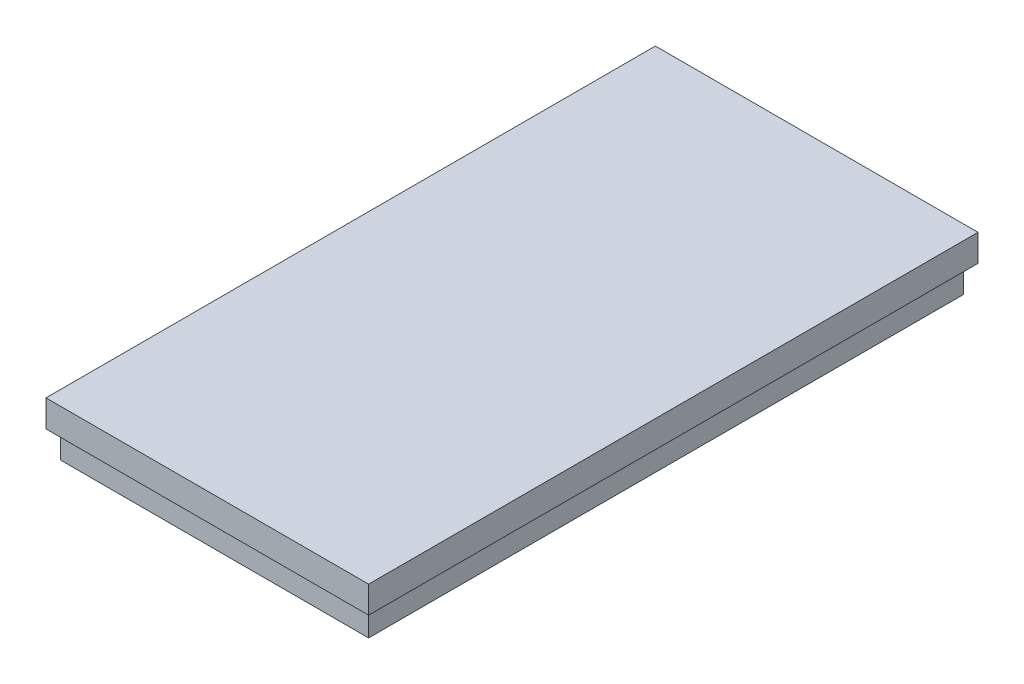
ISO-10303-21;
HEADER;
FILE_DESCRIPTION(('STEP AP214'),'2;1');
FILE_NAME('part.step','',(''),(''),'','','');
FILE_SCHEMA(('AUTOMOTIVE_DESIGN { 1 0 10303 214 1 1 1 1 }'));
ENDSEC;
DATA;
#1=APPLICATION_CONTEXT('core data for automotive mechanical design processes');
#2=APPLICATION_PROTOCOL_DEFINITION('international standard','automotive_design',2000,#1);
#3=PRODUCT_CONTEXT('',#1,'mechanical');
#4=PRODUCT('Part','Part','',(#3));
#5=PRODUCT_RELATED_PRODUCT_CATEGORY('part','',(#4));
#6=PRODUCT_DEFINITION_FORMATION('','',#4);
#7=PRODUCT_DEFINITION_CONTEXT('part definition',#1,'design');
#8=PRODUCT_DEFINITION('design','',#6,#7);
#9=PRODUCT_DEFINITION_SHAPE('','',#8);
#10=(LENGTH_UNIT() NAMED_UNIT(*) SI_UNIT(.MILLI.,.METRE.));
#11=(NAMED_UNIT(*) PLANE_ANGLE_UNIT() SI_UNIT($,.RADIAN.));
#12=(NAMED_UNIT(*) SI_UNIT($,.STERADIAN.) SOLID_ANGLE_UNIT());
#13=UNCERTAINTY_MEASURE_WITH_UNIT(LENGTH_MEASURE(1.E-05),#10,'distance_accuracy_value','');
#14=(GEOMETRIC_REPRESENTATION_CONTEXT(3) GLOBAL_UNCERTAINTY_ASSIGNED_CONTEXT((#13)) GLOBAL_UNIT_ASSIGNED_CONTEXT((#10,
#11,#12)) REPRESENTATION_CONTEXT('',''));
#15=CARTESIAN_POINT('',(0.,0.,0.));
#16=DIRECTION('',(0.,0.,1.));
#17=DIRECTION('',(1.,0.,0.));
#18=AXIS2_PLACEMENT_3D('',#15,#16,#17);
#19=CARTESIAN_POINT('',(0.,0.,0.));
#20=DIRECTION('',(0.,1.,0.));
#21=DIRECTION('',(0.,0.,1.));
#22=AXIS2_PLACEMENT_3D('',#19,#20,#21);
#23=PLANE('',#22);
#24=DIRECTION('',(0.,0.,1.));
#25=VECTOR('',#24,1.);
#26=CARTESIAN_POINT('',(-45.,0.,-85.));
#27=LINE('',#26,#25);
#28=CARTESIAN_POINT('',(-45.,0.,-85.));
#29=VERTEX_POINT('',#28);
#30=CARTESIAN_POINT('',(-45.,0.,85.));
#31=VERTEX_POINT('',#30);
#32=EDGE_CURVE('E190',#29,#31,#27,.T.);
#33=ORIENTED_EDGE('',*,*,#32,.F.);
#34=DIRECTION('',(-1.,0.,0.));
#35=VECTOR('',#34,1.);
#36=CARTESIAN_POINT('',(-45.,0.,-85.));
#37=LINE('',#36,#35);
#38=CARTESIAN_POINT('',(45.,0.,-85.));
#39=VERTEX_POINT('',#38);
#40=EDGE_CURVE('E195',#39,#29,#37,.T.);
#41=ORIENTED_EDGE('',*,*,#40,.F.);
#42=DIRECTION('',(0.,0.,-1.));
#43=VECTOR('',#42,1.);
#44=CARTESIAN_POINT('',(45.,0.,-85.));
#45=LINE('',#44,#43);
#46=CARTESIAN_POINT('',(45.,0.,85.));
#47=VERTEX_POINT('',#46);
#48=EDGE_CURVE('E206',#47,#39,#45,.T.);
#49=ORIENTED_EDGE('',*,*,#48,.F.);
#50=DIRECTION('',(1.,0.,0.));
#51=VECTOR('',#50,1.);
#52=CARTESIAN_POINT('',(-45.,0.,85.));
#53=LINE('',#52,#51);
#54=EDGE_CURVE('E204',#31,#47,#53,.T.);
#55=ORIENTED_EDGE('',*,*,#54,.F.);
#56=EDGE_LOOP('',(#33,#41,#49,#55));
#57=FACE_BOUND('',#56,.T.);
#58=DIRECTION('',(0.,0.,-1.));
#59=VECTOR('',#58,1.);
#60=CARTESIAN_POINT('',(-43.,0.,83.));
#61=LINE('',#60,#59);
#62=CARTESIAN_POINT('',(-43.,0.,83.));
#63=VERTEX_POINT('',#62);
#64=CARTESIAN_POINT('',(-43.,0.,-83.));
#65=VERTEX_POINT('',#64);
#66=EDGE_CURVE('E56',#63,#65,#61,.T.);
#67=ORIENTED_EDGE('',*,*,#66,.F.);
#68=DIRECTION('',(-1.,0.,0.));
#69=VECTOR('',#68,1.);
#70=CARTESIAN_POINT('',(-43.,0.,83.));
#71=LINE('',#70,#69);
#72=CARTESIAN_POINT('',(43.,0.,83.));
#73=VERTEX_POINT('',#72);
#74=EDGE_CURVE('E164',#73,#63,#71,.T.);
#75=ORIENTED_EDGE('',*,*,#74,.F.);
#76=DIRECTION('',(0.,0.,1.));
#77=VECTOR('',#76,1.);
#78=CARTESIAN_POINT('',(43.,0.,83.));
#79=LINE('',#78,#77);
#80=CARTESIAN_POINT('',(43.,0.,-83.));
#81=VERTEX_POINT('',#80);
#82=EDGE_CURVE('E175',#81,#73,#79,.T.);
#83=ORIENTED_EDGE('',*,*,#82,.F.);
#84=DIRECTION('',(1.,0.,0.));
#85=VECTOR('',#84,1.);
#86=CARTESIAN_POINT('',(-43.,0.,-83.));
#87=LINE('',#86,#85);
#88=EDGE_CURVE('E172',#65,#81,#87,.T.);
#89=ORIENTED_EDGE('',*,*,#88,.F.);
#90=EDGE_LOOP('',(#67,#75,#83,#89));
#91=FACE_BOUND('',#90,.T.);
#92=ADVANCED_FACE('F33',(#57,#91),#23,.F.);
#93=CARTESIAN_POINT('',(-45.,7.5,-85.));
#94=DIRECTION('',(1.,0.,0.));
#95=DIRECTION('',(0.,0.,-1.));
#96=AXIS2_PLACEMENT_3D('',#93,#94,#95);
#97=PLANE('',#96);
#98=ORIENTED_EDGE('',*,*,#32,.T.);
#99=DIRECTION('',(0.,-1.,0.));
#100=VECTOR('',#99,1.);
#101=CARTESIAN_POINT('',(-45.,7.5,85.));
#102=LINE('',#101,#100);
#103=CARTESIAN_POINT('',(-45.,7.5,85.));
#104=VERTEX_POINT('',#103);
#105=EDGE_CURVE('E11',#104,#31,#102,.T.);
#106=ORIENTED_EDGE('',*,*,#105,.F.);
#107=DIRECTION('',(0.,0.,1.));
#108=VECTOR('',#107,1.);
#109=CARTESIAN_POINT('',(-45.,7.5,-85.));
#110=LINE('',#109,#108);
#111=CARTESIAN_POINT('',(-45.,7.5,-85.));
#112=VERTEX_POINT('',#111);
#113=EDGE_CURVE('E191',#112,#104,#110,.T.);
#114=ORIENTED_EDGE('',*,*,#113,.F.);
#115=DIRECTION('',(0.,-1.,0.));
#116=VECTOR('',#115,1.);
#117=CARTESIAN_POINT('',(-45.,7.5,-85.));
#118=LINE('',#117,#116);
#119=EDGE_CURVE('E201',#112,#29,#118,.T.);
#120=ORIENTED_EDGE('',*,*,#119,.T.);
#121=EDGE_LOOP('',(#98,#106,#114,#120));
#122=FACE_BOUND('',#121,.T.);
#123=ADVANCED_FACE('F35',(#122),#97,.F.);
#124=CARTESIAN_POINT('',(-45.,7.5,85.));
#125=DIRECTION('',(0.,0.,-1.));
#126=DIRECTION('',(-1.,0.,0.));
#127=AXIS2_PLACEMENT_3D('',#124,#125,#126);
#128=PLANE('',#127);
#129=ORIENTED_EDGE('',*,*,#54,.T.);
#130=DIRECTION('',(0.,-1.,0.));
#131=VECTOR('',#130,1.);
#132=CARTESIAN_POINT('',(45.,7.5,85.));
#133=LINE('',#132,#131);
#134=CARTESIAN_POINT('',(45.,7.5,85.));
#135=VERTEX_POINT('',#134);
#136=EDGE_CURVE('E41',#135,#47,#133,.T.);
#137=ORIENTED_EDGE('',*,*,#136,.F.);
#138=DIRECTION('',(1.,0.,0.));
#139=VECTOR('',#138,1.);
#140=CARTESIAN_POINT('',(-45.,7.5,85.));
#141=LINE('',#140,#139);
#142=EDGE_CURVE('E194',#104,#135,#141,.T.);
#143=ORIENTED_EDGE('',*,*,#142,.F.);
#144=ORIENTED_EDGE('',*,*,#105,.T.);
#145=EDGE_LOOP('',(#129,#137,#143,#144));
#146=FACE_BOUND('',#145,.T.);
#147=ADVANCED_FACE('F233',(#146),#128,.F.);
#148=CARTESIAN_POINT('',(45.,7.5,-85.));
#149=DIRECTION('',(-1.,0.,0.));
#150=DIRECTION('',(0.,0.,1.));
#151=AXIS2_PLACEMENT_3D('',#148,#149,#150);
#152=PLANE('',#151);
#153=ORIENTED_EDGE('',*,*,#48,.T.);
#154=DIRECTION('',(0.,-1.,0.));
#155=VECTOR('',#154,1.);
#156=CARTESIAN_POINT('',(45.,7.5,-85.));
#157=LINE('',#156,#155);
#158=CARTESIAN_POINT('',(45.,7.5,-85.));
#159=VERTEX_POINT('',#158);
#160=EDGE_CURVE('E211',#159,#39,#157,.T.);
#161=ORIENTED_EDGE('',*,*,#160,.F.);
#162=DIRECTION('',(0.,0.,-1.));
#163=VECTOR('',#162,1.);
#164=CARTESIAN_POINT('',(45.,7.5,-85.));
#165=LINE('',#164,#163);
#166=EDGE_CURVE('E197',#135,#159,#165,.T.);
#167=ORIENTED_EDGE('',*,*,#166,.F.);
#168=ORIENTED_EDGE('',*,*,#136,.T.);
#169=EDGE_LOOP('',(#153,#161,#167,#168));
#170=FACE_BOUND('',#169,.T.);
#171=ADVANCED_FACE('F218',(#170),#152,.F.);
#172=CARTESIAN_POINT('',(-45.,7.5,-85.));
#173=DIRECTION('',(0.,0.,1.));
#174=DIRECTION('',(1.,0.,0.));
#175=AXIS2_PLACEMENT_3D('',#172,#173,#174);
#176=PLANE('',#175);
#177=ORIENTED_EDGE('',*,*,#40,.T.);
#178=ORIENTED_EDGE('',*,*,#119,.F.);
#179=DIRECTION('',(-1.,0.,0.));
#180=VECTOR('',#179,1.);
#181=CARTESIAN_POINT('',(-45.,7.5,-85.));
#182=LINE('',#181,#180);
#183=EDGE_CURVE('E199',#159,#112,#182,.T.);
#184=ORIENTED_EDGE('',*,*,#183,.F.);
#185=ORIENTED_EDGE('',*,*,#160,.T.);
#186=EDGE_LOOP('',(#177,#178,#184,#185));
#187=FACE_BOUND('',#186,.T.);
#188=ADVANCED_FACE('F226',(#187),#176,.F.);
#189=CARTESIAN_POINT('',(0.,7.5,0.));
#190=DIRECTION('',(0.,1.,0.));
#191=DIRECTION('',(0.,0.,1.));
#192=AXIS2_PLACEMENT_3D('',#189,#190,#191);
#193=PLANE('',#192);
#194=ORIENTED_EDGE('',*,*,#113,.T.);
#195=ORIENTED_EDGE('',*,*,#142,.T.);
#196=ORIENTED_EDGE('',*,*,#166,.T.);
#197=ORIENTED_EDGE('',*,*,#183,.T.);
#198=EDGE_LOOP('',(#194,#195,#196,#197));
#199=FACE_BOUND('',#198,.T.);
#200=ADVANCED_FACE('F232',(#199),#193,.T.);
#201=CARTESIAN_POINT('',(-43.,-7.5,83.));
#202=DIRECTION('',(1.,0.,0.));
#203=DIRECTION('',(0.,0.,-1.));
#204=AXIS2_PLACEMENT_3D('',#201,#202,#203);
#205=PLANE('',#204);
#206=ORIENTED_EDGE('',*,*,#66,.T.);
#207=DIRECTION('',(0.,1.,0.));
#208=VECTOR('',#207,1.);
#209=CARTESIAN_POINT('',(-43.,-7.5,-83.));
#210=LINE('',#209,#208);
#211=CARTESIAN_POINT('',(-43.,-7.5,-83.));
#212=VERTEX_POINT('',#211);
#213=EDGE_CURVE('E187',#212,#65,#210,.T.);
#214=ORIENTED_EDGE('',*,*,#213,.F.);
#215=DIRECTION('',(0.,0.,-1.));
#216=VECTOR('',#215,1.);
#217=CARTESIAN_POINT('',(-43.,-7.5,83.));
#218=LINE('',#217,#216);
#219=CARTESIAN_POINT('',(-43.,-7.5,83.));
#220=VERTEX_POINT('',#219);
#221=EDGE_CURVE('E160',#220,#212,#218,.T.);
#222=ORIENTED_EDGE('',*,*,#221,.F.);
#223=DIRECTION('',(0.,1.,0.));
#224=VECTOR('',#223,1.);
#225=CARTESIAN_POINT('',(-43.,-7.5,83.));
#226=LINE('',#225,#224);
#227=EDGE_CURVE('E170',#220,#63,#226,.T.);
#228=ORIENTED_EDGE('',*,*,#227,.T.);
#229=EDGE_LOOP('',(#206,#214,#222,#228));
#230=FACE_BOUND('',#229,.T.);
#231=ADVANCED_FACE('F251',(#230),#205,.F.);
#232=CARTESIAN_POINT('',(-43.,-7.5,-83.));
#233=DIRECTION('',(0.,0.,1.));
#234=DIRECTION('',(1.,0.,0.));
#235=AXIS2_PLACEMENT_3D('',#232,#233,#234);
#236=PLANE('',#235);
#237=ORIENTED_EDGE('',*,*,#88,.T.);
#238=DIRECTION('',(0.,1.,0.));
#239=VECTOR('',#238,1.);
#240=CARTESIAN_POINT('',(43.,-7.5,-83.));
#241=LINE('',#240,#239);
#242=CARTESIAN_POINT('',(43.,-7.5,-83.));
#243=VERTEX_POINT('',#242);
#244=EDGE_CURVE('E184',#243,#81,#241,.T.);
#245=ORIENTED_EDGE('',*,*,#244,.F.);
#246=DIRECTION('',(1.,0.,0.));
#247=VECTOR('',#246,1.);
#248=CARTESIAN_POINT('',(-43.,-7.5,-83.));
#249=LINE('',#248,#247);
#250=EDGE_CURVE('E163',#212,#243,#249,.T.);
#251=ORIENTED_EDGE('',*,*,#250,.F.);
#252=ORIENTED_EDGE('',*,*,#213,.T.);
#253=EDGE_LOOP('',(#237,#245,#251,#252));
#254=FACE_BOUND('',#253,.T.);
#255=ADVANCED_FACE('F255',(#254),#236,.F.);
#256=CARTESIAN_POINT('',(43.,-7.5,83.));
#257=DIRECTION('',(-1.,0.,0.));
#258=DIRECTION('',(0.,0.,1.));
#259=AXIS2_PLACEMENT_3D('',#256,#257,#258);
#260=PLANE('',#259);
#261=ORIENTED_EDGE('',*,*,#82,.T.);
#262=DIRECTION('',(0.,1.,0.));
#263=VECTOR('',#262,1.);
#264=CARTESIAN_POINT('',(43.,-7.5,83.));
#265=LINE('',#264,#263);
#266=CARTESIAN_POINT('',(43.,-7.5,83.));
#267=VERTEX_POINT('',#266);
#268=EDGE_CURVE('E181',#267,#73,#265,.T.);
#269=ORIENTED_EDGE('',*,*,#268,.F.);
#270=DIRECTION('',(0.,0.,1.));
#271=VECTOR('',#270,1.);
#272=CARTESIAN_POINT('',(43.,-7.5,83.));
#273=LINE('',#272,#271);
#274=EDGE_CURVE('E166',#243,#267,#273,.T.);
#275=ORIENTED_EDGE('',*,*,#274,.F.);
#276=ORIENTED_EDGE('',*,*,#244,.T.);
#277=EDGE_LOOP('',(#261,#269,#275,#276));
#278=FACE_BOUND('',#277,.T.);
#279=ADVANCED_FACE('F260',(#278),#260,.F.);
#280=CARTESIAN_POINT('',(-43.,-7.5,83.));
#281=DIRECTION('',(0.,0.,-1.));
#282=DIRECTION('',(-1.,0.,0.));
#283=AXIS2_PLACEMENT_3D('',#280,#281,#282);
#284=PLANE('',#283);
#285=ORIENTED_EDGE('',*,*,#74,.T.);
#286=ORIENTED_EDGE('',*,*,#227,.F.);
#287=DIRECTION('',(-1.,0.,0.));
#288=VECTOR('',#287,1.);
#289=CARTESIAN_POINT('',(-43.,-7.5,83.));
#290=LINE('',#289,#288);
#291=EDGE_CURVE('E168',#267,#220,#290,.T.);
#292=ORIENTED_EDGE('',*,*,#291,.F.);
#293=ORIENTED_EDGE('',*,*,#268,.T.);
#294=EDGE_LOOP('',(#285,#286,#292,#293));
#295=FACE_BOUND('',#294,.T.);
#296=ADVANCED_FACE('F266',(#295),#284,.F.);
#297=CARTESIAN_POINT('',(0.,-7.5,0.));
#298=DIRECTION('',(0.,-1.,0.));
#299=DIRECTION('',(0.,0.,-1.));
#300=AXIS2_PLACEMENT_3D('',#297,#298,#299);
#301=PLANE('',#300);
#302=DIRECTION('',(0.,0.,-1.));
#303=VECTOR('',#302,1.);
#304=CARTESIAN_POINT('',(-36.,-7.5,76.));
#305=LINE('',#304,#303);
#306=CARTESIAN_POINT('',(-36.,-7.5,76.));
#307=VERTEX_POINT('',#306);
#308=CARTESIAN_POINT('',(-36.,-7.5,-76.));
#309=VERTEX_POINT('',#308);
#310=EDGE_CURVE('E48',#307,#309,#305,.T.);
#311=ORIENTED_EDGE('',*,*,#310,.F.);
#312=DIRECTION('',(-1.,0.,0.));
#313=VECTOR('',#312,1.);
#314=CARTESIAN_POINT('',(-36.,-7.5,76.));
#315=LINE('',#314,#313);
#316=CARTESIAN_POINT('',(36.,-7.5,76.));
#317=VERTEX_POINT('',#316);
#318=EDGE_CURVE('E142',#317,#307,#315,.T.);
#319=ORIENTED_EDGE('',*,*,#318,.F.);
#320=DIRECTION('',(0.,0.,1.));
#321=VECTOR('',#320,1.);
#322=CARTESIAN_POINT('',(36.,-7.5,76.));
#323=LINE('',#322,#321);
#324=CARTESIAN_POINT('',(36.,-7.5,-76.));
#325=VERTEX_POINT('',#324);
#326=EDGE_CURVE('E145',#325,#317,#323,.T.);
#327=ORIENTED_EDGE('',*,*,#326,.F.);
#328=DIRECTION('',(1.,0.,0.));
#329=VECTOR('',#328,1.);
#330=CARTESIAN_POINT('',(-36.,-7.5,-76.));
#331=LINE('',#330,#329);
#332=EDGE_CURVE('E151',#309,#325,#331,.T.);
#333=ORIENTED_EDGE('',*,*,#332,.F.);
#334=EDGE_LOOP('',(#311,#319,#327,#333));
#335=FACE_BOUND('',#334,.T.);
#336=ORIENTED_EDGE('',*,*,#221,.T.);
#337=ORIENTED_EDGE('',*,*,#250,.T.);
#338=ORIENTED_EDGE('',*,*,#274,.T.);
#339=ORIENTED_EDGE('',*,*,#291,.T.);
#340=EDGE_LOOP('',(#336,#337,#338,#339));
#341=FACE_BOUND('',#340,.T.);
#342=ADVANCED_FACE('F270',(#335,#341),#301,.T.);
#343=CARTESIAN_POINT('',(-36.,0.,76.));
#344=DIRECTION('',(-1.,0.,0.));
#345=DIRECTION('',(0.,0.,1.));
#346=AXIS2_PLACEMENT_3D('',#343,#344,#345);
#347=PLANE('',#346);
#348=ORIENTED_EDGE('',*,*,#310,.T.);
#349=DIRECTION('',(0.,-1.,0.));
#350=VECTOR('',#349,1.);
#351=CARTESIAN_POINT('',(-36.,0.,-76.));
#352=LINE('',#351,#350);
#353=CARTESIAN_POINT('',(-36.,0.,-76.));
#354=VERTEX_POINT('',#353);
#355=EDGE_CURVE('E120',#354,#309,#352,.T.);
#356=ORIENTED_EDGE('',*,*,#355,.F.);
#357=DIRECTION('',(0.,0.,-1.));
#358=VECTOR('',#357,1.);
#359=CARTESIAN_POINT('',(-36.,0.,76.));
#360=LINE('',#359,#358);
#361=CARTESIAN_POINT('',(-36.,0.,76.));
#362=VERTEX_POINT('',#361);
#363=EDGE_CURVE('E124',#362,#354,#360,.T.);
#364=ORIENTED_EDGE('',*,*,#363,.F.);
#365=DIRECTION('',(0.,-1.,0.));
#366=VECTOR('',#365,1.);
#367=CARTESIAN_POINT('',(-36.,0.,76.));
#368=LINE('',#367,#366);
#369=EDGE_CURVE('E155',#362,#307,#368,.T.);
#370=ORIENTED_EDGE('',*,*,#369,.T.);
#371=EDGE_LOOP('',(#348,#356,#364,#370));
#372=FACE_BOUND('',#371,.T.);
#373=ADVANCED_FACE('F122',(#372),#347,.F.);
#374=CARTESIAN_POINT('',(-36.,0.,76.));
#375=DIRECTION('',(0.,0.,1.));
#376=DIRECTION('',(1.,0.,0.));
#377=AXIS2_PLACEMENT_3D('',#374,#375,#376);
#378=PLANE('',#377);
#379=ORIENTED_EDGE('',*,*,#318,.T.);
#380=ORIENTED_EDGE('',*,*,#369,.F.);
#381=DIRECTION('',(-1.,0.,0.));
#382=VECTOR('',#381,1.);
#383=CARTESIAN_POINT('',(-36.,0.,76.));
#384=LINE('',#383,#382);
#385=CARTESIAN_POINT('',(36.,0.,76.));
#386=VERTEX_POINT('',#385);
#387=EDGE_CURVE('E130',#386,#362,#384,.T.);
#388=ORIENTED_EDGE('',*,*,#387,.F.);
#389=DIRECTION('',(0.,-1.,0.));
#390=VECTOR('',#389,1.);
#391=CARTESIAN_POINT('',(36.,0.,76.));
#392=LINE('',#391,#390);
#393=EDGE_CURVE('E157',#386,#317,#392,.T.);
#394=ORIENTED_EDGE('',*,*,#393,.T.);
#395=EDGE_LOOP('',(#379,#380,#388,#394));
#396=FACE_BOUND('',#395,.T.);
#397=ADVANCED_FACE('F277',(#396),#378,.F.);
#398=CARTESIAN_POINT('',(36.,0.,76.));
#399=DIRECTION('',(1.,0.,0.));
#400=DIRECTION('',(0.,0.,-1.));
#401=AXIS2_PLACEMENT_3D('',#398,#399,#400);
#402=PLANE('',#401);
#403=ORIENTED_EDGE('',*,*,#326,.T.);
#404=ORIENTED_EDGE('',*,*,#393,.F.);
#405=DIRECTION('',(0.,0.,1.));
#406=VECTOR('',#405,1.);
#407=CARTESIAN_POINT('',(36.,0.,76.));
#408=LINE('',#407,#406);
#409=CARTESIAN_POINT('',(36.,0.,-76.));
#410=VERTEX_POINT('',#409);
#411=EDGE_CURVE('E138',#410,#386,#408,.T.);
#412=ORIENTED_EDGE('',*,*,#411,.F.);
#413=DIRECTION('',(0.,-1.,0.));
#414=VECTOR('',#413,1.);
#415=CARTESIAN_POINT('',(36.,0.,-76.));
#416=LINE('',#415,#414);
#417=EDGE_CURVE('E129',#410,#325,#416,.T.);
#418=ORIENTED_EDGE('',*,*,#417,.T.);
#419=EDGE_LOOP('',(#403,#404,#412,#418));
#420=FACE_BOUND('',#419,.T.);
#421=ADVANCED_FACE('F280',(#420),#402,.F.);
#422=CARTESIAN_POINT('',(-36.,0.,-76.));
#423=DIRECTION('',(0.,0.,-1.));
#424=DIRECTION('',(-1.,0.,0.));
#425=AXIS2_PLACEMENT_3D('',#422,#423,#424);
#426=PLANE('',#425);
#427=ORIENTED_EDGE('',*,*,#332,.T.);
#428=ORIENTED_EDGE('',*,*,#417,.F.);
#429=DIRECTION('',(1.,0.,0.));
#430=VECTOR('',#429,1.);
#431=CARTESIAN_POINT('',(-36.,0.,-76.));
#432=LINE('',#431,#430);
#433=EDGE_CURVE('E133',#354,#410,#432,.T.);
#434=ORIENTED_EDGE('',*,*,#433,.F.);
#435=ORIENTED_EDGE('',*,*,#355,.T.);
#436=EDGE_LOOP('',(#427,#428,#434,#435));
#437=FACE_BOUND('',#436,.T.);
#438=ADVANCED_FACE('F134',(#437),#426,.F.);
#439=CARTESIAN_POINT('',(0.,0.,0.));
#440=DIRECTION('',(0.,-1.,0.));
#441=DIRECTION('',(0.,0.,-1.));
#442=AXIS2_PLACEMENT_3D('',#439,#440,#441);
#443=PLANE('',#442);
#444=ORIENTED_EDGE('',*,*,#363,.T.);
#445=ORIENTED_EDGE('',*,*,#433,.T.);
#446=ORIENTED_EDGE('',*,*,#411,.T.);
#447=ORIENTED_EDGE('',*,*,#387,.T.);
#448=EDGE_LOOP('',(#444,#445,#446,#447));
#449=FACE_BOUND('',#448,.T.);
#450=ADVANCED_FACE('F140',(#449),#443,.T.);
#451=CLOSED_SHELL('',(#92,#123,#147,#171,#188,#200,#231,#255,#279,#296,#342,#373,#397,#421,#438,#450));
#452=MANIFOLD_SOLID_BREP('B2',#451);
#453=ADVANCED_BREP_SHAPE_REPRESENTATION('',(#18,#452),#14);
#454=SHAPE_DEFINITION_REPRESENTATION(#9,#453);
ENDSEC;
END-ISO-10303-21;
